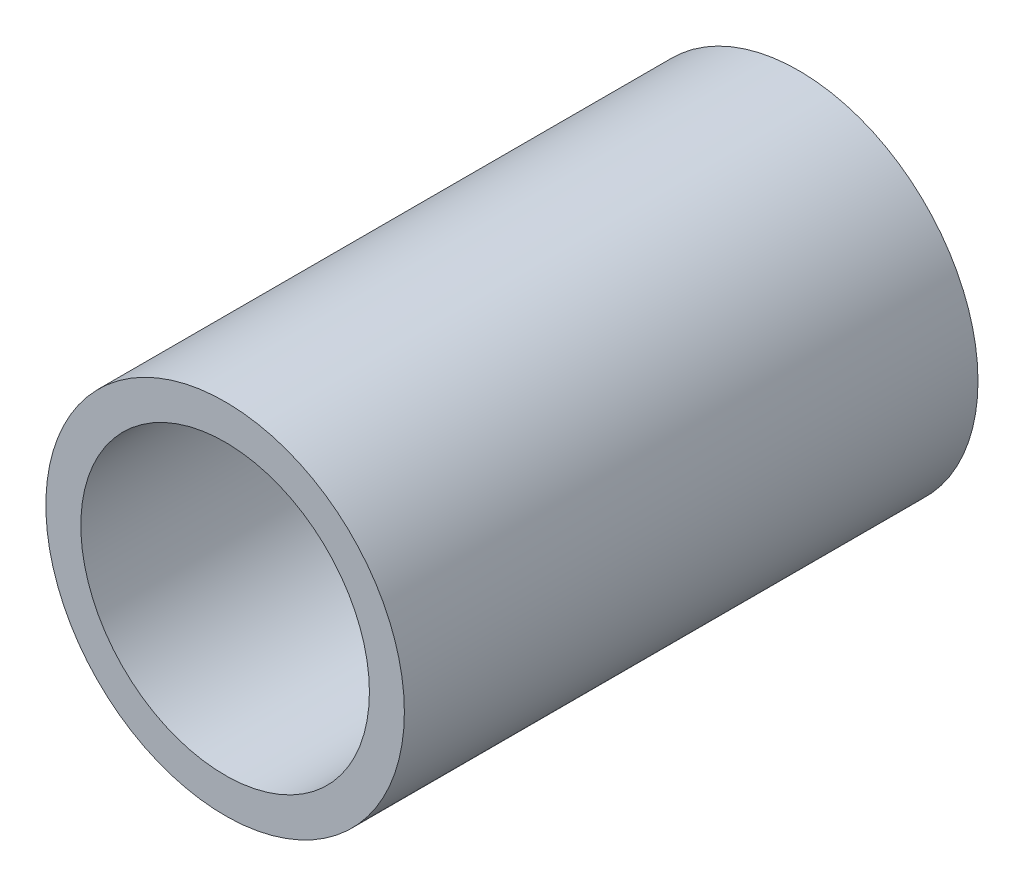
ISO-10303-21;
HEADER;
FILE_DESCRIPTION(('STEP AP214'),'2;1');
FILE_NAME('part.step','',(''),(''),'','','');
FILE_SCHEMA(('AUTOMOTIVE_DESIGN { 1 0 10303 214 1 1 1 1 }'));
ENDSEC;
DATA;
#1=APPLICATION_CONTEXT('core data for automotive mechanical design processes');
#2=APPLICATION_PROTOCOL_DEFINITION('international standard','automotive_design',2000,#1);
#3=PRODUCT_CONTEXT('',#1,'mechanical');
#4=PRODUCT('Part','Part','',(#3));
#5=PRODUCT_RELATED_PRODUCT_CATEGORY('part','',(#4));
#6=PRODUCT_DEFINITION_FORMATION('','',#4);
#7=PRODUCT_DEFINITION_CONTEXT('part definition',#1,'design');
#8=PRODUCT_DEFINITION('design','',#6,#7);
#9=PRODUCT_DEFINITION_SHAPE('','',#8);
#10=(LENGTH_UNIT() NAMED_UNIT(*) SI_UNIT(.MILLI.,.METRE.));
#11=(NAMED_UNIT(*) PLANE_ANGLE_UNIT() SI_UNIT($,.RADIAN.));
#12=(NAMED_UNIT(*) SI_UNIT($,.STERADIAN.) SOLID_ANGLE_UNIT());
#13=UNCERTAINTY_MEASURE_WITH_UNIT(LENGTH_MEASURE(1.E-05),#10,'distance_accuracy_value','');
#14=(GEOMETRIC_REPRESENTATION_CONTEXT(3) GLOBAL_UNCERTAINTY_ASSIGNED_CONTEXT((#13)) GLOBAL_UNIT_ASSIGNED_CONTEXT((#10,
#11,#12)) REPRESENTATION_CONTEXT('',''));
#15=CARTESIAN_POINT('',(0.,0.,0.));
#16=DIRECTION('',(0.,0.,1.));
#17=DIRECTION('',(1.,0.,0.));
#18=AXIS2_PLACEMENT_3D('',#15,#16,#17);
#19=CARTESIAN_POINT('',(0.,0.,16.));
#20=DIRECTION('',(0.,0.,1.));
#21=DIRECTION('',(1.,0.,0.));
#22=AXIS2_PLACEMENT_3D('',#19,#20,#21);
#23=PLANE('',#22);
#24=CARTESIAN_POINT('',(0.,0.,16.));
#25=DIRECTION('',(0.,0.,1.));
#26=DIRECTION('',(1.,0.,0.));
#27=AXIS2_PLACEMENT_3D('',#24,#25,#26);
#28=CIRCLE('',#27,5.);
#29=CARTESIAN_POINT('',(5.,0.,16.));
#30=VERTEX_POINT('',#29);
#31=EDGE_CURVE('E10',#30,#30,#28,.T.);
#32=ORIENTED_EDGE('',*,*,#31,.T.);
#33=EDGE_LOOP('',(#32));
#34=FACE_BOUND('',#33,.T.);
#35=CARTESIAN_POINT('',(0.,0.,16.));
#36=DIRECTION('',(0.,0.,1.));
#37=DIRECTION('',(1.,0.,0.));
#38=AXIS2_PLACEMENT_3D('',#35,#36,#37);
#39=CIRCLE('',#38,4.025);
#40=CARTESIAN_POINT('',(4.025,0.,16.));
#41=VERTEX_POINT('',#40);
#42=EDGE_CURVE('E56',#41,#41,#39,.T.);
#43=ORIENTED_EDGE('',*,*,#42,.F.);
#44=EDGE_LOOP('',(#43));
#45=FACE_BOUND('',#44,.T.);
#46=ADVANCED_FACE('F43',(#34,#45),#23,.T.);
#47=CARTESIAN_POINT('',(0.,0.,0.));
#48=DIRECTION('',(0.,0.,1.));
#49=DIRECTION('',(1.,0.,0.));
#50=AXIS2_PLACEMENT_3D('',#47,#48,#49);
#51=PLANE('',#50);
#52=CARTESIAN_POINT('',(0.,0.,0.));
#53=DIRECTION('',(0.,0.,1.));
#54=DIRECTION('',(1.,0.,0.));
#55=AXIS2_PLACEMENT_3D('',#52,#53,#54);
#56=CIRCLE('',#55,5.);
#57=CARTESIAN_POINT('',(5.,0.,0.));
#58=VERTEX_POINT('',#57);
#59=EDGE_CURVE('E47',#58,#58,#56,.T.);
#60=ORIENTED_EDGE('',*,*,#59,.F.);
#61=EDGE_LOOP('',(#60));
#62=FACE_BOUND('',#61,.T.);
#63=CARTESIAN_POINT('',(0.,0.,0.));
#64=DIRECTION('',(0.,0.,1.));
#65=DIRECTION('',(1.,0.,0.));
#66=AXIS2_PLACEMENT_3D('',#63,#64,#65);
#67=CIRCLE('',#66,4.025);
#68=CARTESIAN_POINT('',(4.025,0.,0.));
#69=VERTEX_POINT('',#68);
#70=EDGE_CURVE('E58',#69,#69,#67,.T.);
#71=ORIENTED_EDGE('',*,*,#70,.T.);
#72=EDGE_LOOP('',(#71));
#73=FACE_BOUND('',#72,.T.);
#74=ADVANCED_FACE('F70',(#62,#73),#51,.F.);
#75=CARTESIAN_POINT('',(0.,0.,16.));
#76=DIRECTION('',(0.,0.,-1.));
#77=DIRECTION('',(-1.,0.,0.));
#78=AXIS2_PLACEMENT_3D('',#75,#76,#77);
#79=CYLINDRICAL_SURFACE('',#78,5.);
#80=ORIENTED_EDGE('',*,*,#31,.F.);
#81=EDGE_LOOP('',(#80));
#82=FACE_BOUND('',#81,.T.);
#83=ORIENTED_EDGE('',*,*,#59,.T.);
#84=EDGE_LOOP('',(#83));
#85=FACE_BOUND('',#84,.T.);
#86=ADVANCED_FACE('F45',(#82,#85),#79,.T.);
#87=CARTESIAN_POINT('',(0.,0.,16.));
#88=DIRECTION('',(0.,0.,-1.));
#89=DIRECTION('',(-1.,0.,0.));
#90=AXIS2_PLACEMENT_3D('',#87,#88,#89);
#91=CYLINDRICAL_SURFACE('',#90,4.025);
#92=ORIENTED_EDGE('',*,*,#42,.T.);
#93=EDGE_LOOP('',(#92));
#94=FACE_BOUND('',#93,.T.);
#95=ORIENTED_EDGE('',*,*,#70,.F.);
#96=EDGE_LOOP('',(#95));
#97=FACE_BOUND('',#96,.T.);
#98=ADVANCED_FACE('F66',(#94,#97),#91,.F.);
#99=CLOSED_SHELL('',(#46,#74,#86,#98));
#100=MANIFOLD_SOLID_BREP('B2',#99);
#101=ADVANCED_BREP_SHAPE_REPRESENTATION('',(#18,#100),#14);
#102=SHAPE_DEFINITION_REPRESENTATION(#9,#101);
ENDSEC;
END-ISO-10303-21;
